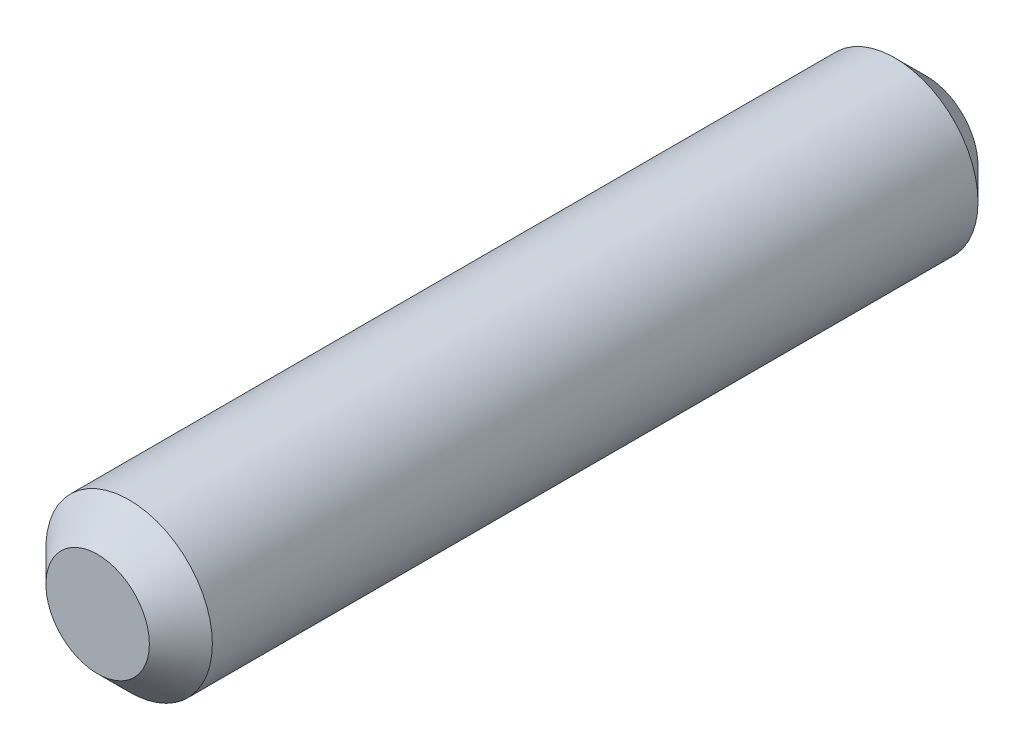
ISO-10303-21;
HEADER;
FILE_DESCRIPTION(('STEP AP214'),'2;1');
FILE_NAME('part.step','',(''),(''),'','','');
FILE_SCHEMA(('AUTOMOTIVE_DESIGN { 1 0 10303 214 1 1 1 1 }'));
ENDSEC;
DATA;
#1=APPLICATION_CONTEXT('core data for automotive mechanical design processes');
#2=APPLICATION_PROTOCOL_DEFINITION('international standard','automotive_design',2000,#1);
#3=PRODUCT_CONTEXT('',#1,'mechanical');
#4=PRODUCT('Part','Part','',(#3));
#5=PRODUCT_RELATED_PRODUCT_CATEGORY('part','',(#4));
#6=PRODUCT_DEFINITION_FORMATION('','',#4);
#7=PRODUCT_DEFINITION_CONTEXT('part definition',#1,'design');
#8=PRODUCT_DEFINITION('design','',#6,#7);
#9=PRODUCT_DEFINITION_SHAPE('','',#8);
#10=(LENGTH_UNIT() NAMED_UNIT(*) SI_UNIT(.MILLI.,.METRE.));
#11=(NAMED_UNIT(*) PLANE_ANGLE_UNIT() SI_UNIT($,.RADIAN.));
#12=(NAMED_UNIT(*) SI_UNIT($,.STERADIAN.) SOLID_ANGLE_UNIT());
#13=UNCERTAINTY_MEASURE_WITH_UNIT(LENGTH_MEASURE(1.E-05),#10,'distance_accuracy_value','');
#14=(GEOMETRIC_REPRESENTATION_CONTEXT(3) GLOBAL_UNCERTAINTY_ASSIGNED_CONTEXT((#13)) GLOBAL_UNIT_ASSIGNED_CONTEXT((#10,
#11,#12)) REPRESENTATION_CONTEXT('',''));
#15=CARTESIAN_POINT('',(0.,0.,0.));
#16=DIRECTION('',(0.,0.,1.));
#17=DIRECTION('',(1.,0.,0.));
#18=AXIS2_PLACEMENT_3D('',#15,#16,#17);
#19=CARTESIAN_POINT('',(0.,0.,7.89));
#20=DIRECTION('',(0.,0.,-1.));
#21=DIRECTION('',(-1.,0.,0.));
#22=AXIS2_PLACEMENT_3D('',#19,#20,#21);
#23=CYLINDRICAL_SURFACE('',#22,1.585);
#24=CARTESIAN_POINT('',(0.,0.,7.29));
#25=DIRECTION('',(0.,0.,1.));
#26=DIRECTION('',(1.,0.,0.));
#27=AXIS2_PLACEMENT_3D('',#24,#25,#26);
#28=CIRCLE('',#27,1.585);
#29=CARTESIAN_POINT('',(1.585,0.,7.29));
#30=VERTEX_POINT('',#29);
#31=EDGE_CURVE('E52',#30,#30,#28,.F.);
#32=ORIENTED_EDGE('',*,*,#31,.T.);
#33=EDGE_LOOP('',(#32));
#34=FACE_BOUND('',#33,.T.);
#35=CARTESIAN_POINT('',(0.,0.,-7.29));
#36=DIRECTION('',(0.,0.,1.));
#37=DIRECTION('',(1.,0.,0.));
#38=AXIS2_PLACEMENT_3D('',#35,#36,#37);
#39=CIRCLE('',#38,1.585);
#40=CARTESIAN_POINT('',(1.585,0.,-7.29));
#41=VERTEX_POINT('',#40);
#42=EDGE_CURVE('E57',#41,#41,#39,.T.);
#43=ORIENTED_EDGE('',*,*,#42,.T.);
#44=EDGE_LOOP('',(#43));
#45=FACE_BOUND('',#44,.T.);
#46=ADVANCED_FACE('F43',(#34,#45),#23,.T.);
#47=CARTESIAN_POINT('',(0.,0.,7.89));
#48=DIRECTION('',(0.,0.,1.));
#49=DIRECTION('',(1.,0.,0.));
#50=AXIS2_PLACEMENT_3D('',#47,#48,#49);
#51=PLANE('',#50);
#52=CARTESIAN_POINT('',(0.,0.,7.89));
#53=DIRECTION('',(0.,0.,1.));
#54=DIRECTION('',(1.,0.,0.));
#55=AXIS2_PLACEMENT_3D('',#52,#53,#54);
#56=CIRCLE('',#55,0.985000000000002);
#57=CARTESIAN_POINT('',(0.985000000000002,0.,7.89));
#58=VERTEX_POINT('',#57);
#59=EDGE_CURVE('E62',#58,#58,#56,.T.);
#60=ORIENTED_EDGE('',*,*,#59,.T.);
#61=EDGE_LOOP('',(#60));
#62=FACE_BOUND('',#61,.T.);
#63=ADVANCED_FACE('F69',(#62),#51,.T.);
#64=CARTESIAN_POINT('',(0.,0.,-7.89));
#65=DIRECTION('',(0.,0.,1.));
#66=DIRECTION('',(1.,0.,0.));
#67=AXIS2_PLACEMENT_3D('',#64,#65,#66);
#68=PLANE('',#67);
#69=CARTESIAN_POINT('',(0.,0.,-7.89));
#70=DIRECTION('',(0.,0.,1.));
#71=DIRECTION('',(1.,0.,0.));
#72=AXIS2_PLACEMENT_3D('',#69,#70,#71);
#73=CIRCLE('',#72,0.984999999999998);
#74=CARTESIAN_POINT('',(0.984999999999997,0.,-7.89));
#75=VERTEX_POINT('',#74);
#76=EDGE_CURVE('E10',#75,#75,#73,.F.);
#77=ORIENTED_EDGE('',*,*,#76,.T.);
#78=EDGE_LOOP('',(#77));
#79=FACE_BOUND('',#78,.T.);
#80=ADVANCED_FACE('F73',(#79),#68,.F.);
#81=CARTESIAN_POINT('',(0.,0.,7.89));
#82=DIRECTION('',(0.,0.,-1.));
#83=DIRECTION('',(-1.,0.,0.));
#84=AXIS2_PLACEMENT_3D('',#81,#82,#83);
#85=CONICAL_SURFACE('',#84,0.985000000000002,0.785398163397446);
#86=ORIENTED_EDGE('',*,*,#31,.F.);
#87=EDGE_LOOP('',(#86));
#88=FACE_BOUND('',#87,.T.);
#89=ORIENTED_EDGE('',*,*,#59,.F.);
#90=EDGE_LOOP('',(#89));
#91=FACE_BOUND('',#90,.T.);
#92=ADVANCED_FACE('F71',(#88,#91),#85,.T.);
#93=CARTESIAN_POINT('',(0.,0.,-7.29));
#94=DIRECTION('',(0.,0.,1.));
#95=DIRECTION('',(1.,0.,0.));
#96=AXIS2_PLACEMENT_3D('',#93,#94,#95);
#97=CONICAL_SURFACE('',#96,1.585,0.785398163397449);
#98=CARTESIAN_POINT('',(0.984999999999997,0.,-7.89));
#99=CARTESIAN_POINT('',(0.991249999999997,0.,-7.88375));
#100=CARTESIAN_POINT('',(0.997499999999997,0.,-7.8775));
#101=CARTESIAN_POINT('',(1.01,0.,-7.865));
#102=CARTESIAN_POINT('',(1.01625,0.,-7.85875));
#103=CARTESIAN_POINT('',(1.02875,0.,-7.84625));
#104=CARTESIAN_POINT('',(1.035,0.,-7.84));
#105=CARTESIAN_POINT('',(1.0475,0.,-7.8275));
#106=CARTESIAN_POINT('',(1.05375,0.,-7.82125));
#107=CARTESIAN_POINT('',(1.06625,0.,-7.80875));
#108=CARTESIAN_POINT('',(1.0725,0.,-7.8025));
#109=CARTESIAN_POINT('',(1.085,0.,-7.79));
#110=CARTESIAN_POINT('',(1.09125,0.,-7.78375));
#111=CARTESIAN_POINT('',(1.10375,0.,-7.77125));
#112=CARTESIAN_POINT('',(1.11,0.,-7.765));
#113=CARTESIAN_POINT('',(1.1225,0.,-7.7525));
#114=CARTESIAN_POINT('',(1.12875,0.,-7.74625));
#115=CARTESIAN_POINT('',(1.14125,0.,-7.73375));
#116=CARTESIAN_POINT('',(1.1475,0.,-7.7275));
#117=CARTESIAN_POINT('',(1.16,0.,-7.715));
#118=CARTESIAN_POINT('',(1.16625,0.,-7.70875));
#119=CARTESIAN_POINT('',(1.17875,0.,-7.69625));
#120=CARTESIAN_POINT('',(1.185,0.,-7.69));
#121=CARTESIAN_POINT('',(1.1975,0.,-7.6775));
#122=CARTESIAN_POINT('',(1.20375,0.,-7.67125));
#123=CARTESIAN_POINT('',(1.21625,0.,-7.65875));
#124=CARTESIAN_POINT('',(1.2225,0.,-7.6525));
#125=CARTESIAN_POINT('',(1.235,0.,-7.64));
#126=CARTESIAN_POINT('',(1.24125,0.,-7.63375));
#127=CARTESIAN_POINT('',(1.25375,0.,-7.62125));
#128=CARTESIAN_POINT('',(1.26,0.,-7.615));
#129=CARTESIAN_POINT('',(1.2725,0.,-7.6025));
#130=CARTESIAN_POINT('',(1.27875,0.,-7.59625));
#131=CARTESIAN_POINT('',(1.29125,0.,-7.58375));
#132=CARTESIAN_POINT('',(1.2975,0.,-7.5775));
#133=CARTESIAN_POINT('',(1.31,0.,-7.565));
#134=CARTESIAN_POINT('',(1.31625,0.,-7.55875));
#135=CARTESIAN_POINT('',(1.32875,0.,-7.54625));
#136=CARTESIAN_POINT('',(1.335,0.,-7.54));
#137=CARTESIAN_POINT('',(1.3475,0.,-7.5275));
#138=CARTESIAN_POINT('',(1.35375,0.,-7.52125));
#139=CARTESIAN_POINT('',(1.36625,0.,-7.50875));
#140=CARTESIAN_POINT('',(1.3725,0.,-7.5025));
#141=CARTESIAN_POINT('',(1.385,0.,-7.49));
#142=CARTESIAN_POINT('',(1.39125,0.,-7.48375));
#143=CARTESIAN_POINT('',(1.40375,0.,-7.47125));
#144=CARTESIAN_POINT('',(1.41,0.,-7.465));
#145=CARTESIAN_POINT('',(1.4225,0.,-7.4525));
#146=CARTESIAN_POINT('',(1.42875,0.,-7.44625));
#147=CARTESIAN_POINT('',(1.44125,0.,-7.43375));
#148=CARTESIAN_POINT('',(1.4475,0.,-7.4275));
#149=CARTESIAN_POINT('',(1.46,0.,-7.415));
#150=CARTESIAN_POINT('',(1.46625,0.,-7.40875));
#151=CARTESIAN_POINT('',(1.47875,0.,-7.39625));
#152=CARTESIAN_POINT('',(1.485,0.,-7.39));
#153=CARTESIAN_POINT('',(1.4975,0.,-7.3775));
#154=CARTESIAN_POINT('',(1.50375,0.,-7.37125));
#155=CARTESIAN_POINT('',(1.51625,0.,-7.35875));
#156=CARTESIAN_POINT('',(1.5225,0.,-7.3525));
#157=CARTESIAN_POINT('',(1.535,0.,-7.34));
#158=CARTESIAN_POINT('',(1.54125,0.,-7.33375));
#159=CARTESIAN_POINT('',(1.55375,0.,-7.32125));
#160=CARTESIAN_POINT('',(1.56,0.,-7.315));
#161=CARTESIAN_POINT('',(1.5725,0.,-7.3025));
#162=CARTESIAN_POINT('',(1.57875,0.,-7.29625));
#163=CARTESIAN_POINT('',(1.585,0.,-7.29));
#164=B_SPLINE_CURVE_WITH_KNOTS('',3,(#98,#99,#100,#101,#102,#103,#104,#105,#106,#107,#108,#109,
#110,#111,#112,#113,#114,#115,#116,#117,#118,#119,#120,#121,#122,#123,#124,#125,#126,#127,#128,
#129,#130,#131,#132,#133,#134,#135,#136,#137,#138,#139,#140,#141,#142,#143,#144,#145,#146,#147,
#148,#149,#150,#151,#152,#153,#154,#155,#156,#157,#158,#159,#160,#161,#162,#163),.UNSPECIFIED.,
.F.,.F.,(4,2,2,2,2,2,2,2,2,2,2,2,2,2,2,2,2,2,2,2,2,2,2,2,2,2,2,2,2,2,2,2,4),(0.,
0.0265165042944954,0.0530330085889907,0.0795495128834861,0.106066017177981,0.132582521472477,
0.159099025766973,0.185615530061469,0.212132034355965,0.23864853865046,0.265165042944956,
0.291681547239451,0.318198051533947,0.344714555828443,0.371231060122938,0.397747564417434,
0.424264068711929,0.450780573006425,0.477297077300921,0.503813581595416,0.530330085889912,
0.556846590184408,0.583363094478903,0.609879598773398,0.636396103067894,0.66291260736239,
0.689429111656886,0.715945615951381,0.742462120245877,0.768978624540372,0.795495128834868,
0.822011633129364,0.84852813742386),.UNSPECIFIED.);
#165=EDGE_CURVE('BSEAM46',#75,#41,#164,.T.);
#166=ORIENTED_EDGE('',*,*,#76,.F.);
#167=ORIENTED_EDGE('',*,*,#42,.F.);
#168=ORIENTED_EDGE('',*,*,#165,.T.);
#169=ORIENTED_EDGE('',*,*,#165,.F.);
#170=EDGE_LOOP('',(#166,#168,#167,#169));
#171=FACE_BOUND('',#170,.T.);
#172=ADVANCED_FACE('F46',(#171),#97,.T.);
#173=CLOSED_SHELL('',(#46,#63,#80,#92,#172));
#174=MANIFOLD_SOLID_BREP('B2',#173);
#175=ADVANCED_BREP_SHAPE_REPRESENTATION('',(#18,#174),#14);
#176=SHAPE_DEFINITION_REPRESENTATION(#9,#175);
ENDSEC;
END-ISO-10303-21;
